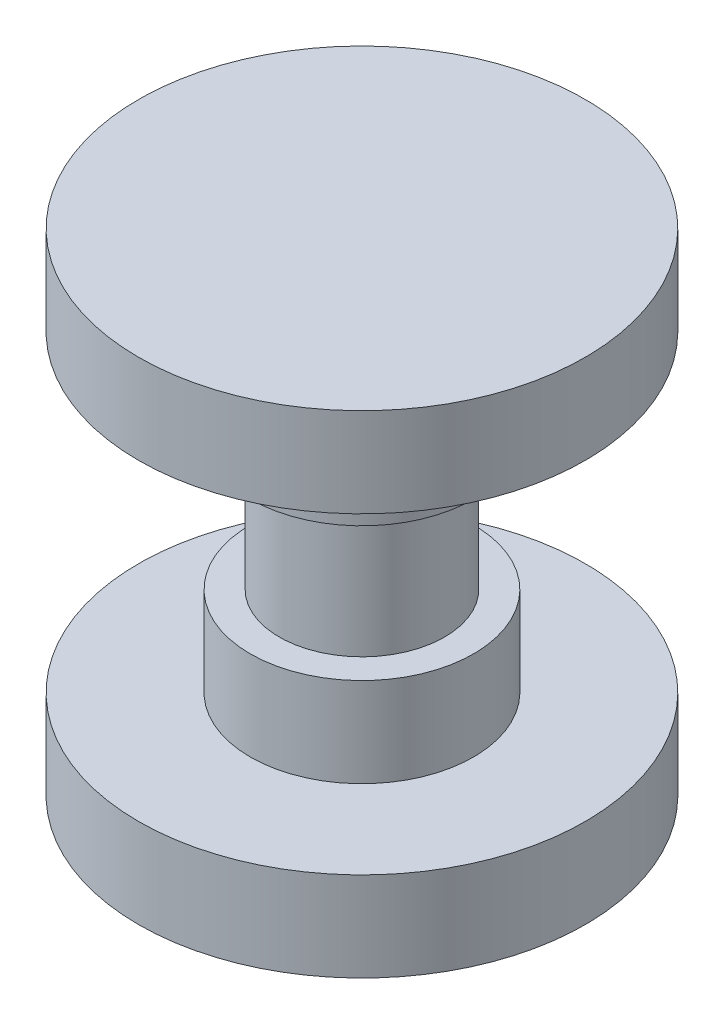
ISO-10303-21;
HEADER;
FILE_DESCRIPTION(('STEP AP214'),'2;1');
FILE_NAME('part.step','',(''),(''),'','','');
FILE_SCHEMA(('AUTOMOTIVE_DESIGN { 1 0 10303 214 1 1 1 1 }'));
ENDSEC;
DATA;
#1=APPLICATION_CONTEXT('core data for automotive mechanical design processes');
#2=APPLICATION_PROTOCOL_DEFINITION('international standard','automotive_design',2000,#1);
#3=PRODUCT_CONTEXT('',#1,'mechanical');
#4=PRODUCT('Part','Part','',(#3));
#5=PRODUCT_RELATED_PRODUCT_CATEGORY('part','',(#4));
#6=PRODUCT_DEFINITION_FORMATION('','',#4);
#7=PRODUCT_DEFINITION_CONTEXT('part definition',#1,'design');
#8=PRODUCT_DEFINITION('design','',#6,#7);
#9=PRODUCT_DEFINITION_SHAPE('','',#8);
#10=(LENGTH_UNIT() NAMED_UNIT(*) SI_UNIT(.MILLI.,.METRE.));
#11=(NAMED_UNIT(*) PLANE_ANGLE_UNIT() SI_UNIT($,.RADIAN.));
#12=(NAMED_UNIT(*) SI_UNIT($,.STERADIAN.) SOLID_ANGLE_UNIT());
#13=UNCERTAINTY_MEASURE_WITH_UNIT(LENGTH_MEASURE(1.E-05),#10,'distance_accuracy_value','');
#14=(GEOMETRIC_REPRESENTATION_CONTEXT(3) GLOBAL_UNCERTAINTY_ASSIGNED_CONTEXT((#13)) GLOBAL_UNIT_ASSIGNED_CONTEXT((#10,
#11,#12)) REPRESENTATION_CONTEXT('',''));
#15=CARTESIAN_POINT('',(0.,0.,0.));
#16=DIRECTION('',(0.,0.,1.));
#17=DIRECTION('',(1.,0.,0.));
#18=AXIS2_PLACEMENT_3D('',#15,#16,#17);
#19=CARTESIAN_POINT('',(0.,12.7,0.));
#20=DIRECTION('',(0.,-1.,0.));
#21=DIRECTION('',(0.,0.,-1.));
#22=AXIS2_PLACEMENT_3D('',#19,#20,#21);
#23=CYLINDRICAL_SURFACE('',#22,31.75);
#24=CARTESIAN_POINT('',(0.,12.7,0.));
#25=DIRECTION('',(0.,1.,0.));
#26=DIRECTION('',(0.,0.,1.));
#27=AXIS2_PLACEMENT_3D('',#24,#25,#26);
#28=CIRCLE('',#27,31.75);
#29=CARTESIAN_POINT('',(0.,12.7,31.75));
#30=VERTEX_POINT('',#29);
#31=EDGE_CURVE('E52',#30,#30,#28,.T.);
#32=ORIENTED_EDGE('',*,*,#31,.F.);
#33=EDGE_LOOP('',(#32));
#34=FACE_BOUND('',#33,.T.);
#35=CARTESIAN_POINT('',(0.,0.,0.));
#36=DIRECTION('',(0.,1.,0.));
#37=DIRECTION('',(0.,0.,1.));
#38=AXIS2_PLACEMENT_3D('',#35,#36,#37);
#39=CIRCLE('',#38,31.75);
#40=CARTESIAN_POINT('',(0.,0.,31.75));
#41=VERTEX_POINT('',#40);
#42=EDGE_CURVE('E43',#41,#41,#39,.T.);
#43=ORIENTED_EDGE('',*,*,#42,.T.);
#44=EDGE_LOOP('',(#43));
#45=FACE_BOUND('',#44,.T.);
#46=ADVANCED_FACE('F40',(#34,#45),#23,.T.);
#47=CARTESIAN_POINT('',(0.,12.7,0.));
#48=DIRECTION('',(0.,1.,0.));
#49=DIRECTION('',(0.,0.,1.));
#50=AXIS2_PLACEMENT_3D('',#47,#48,#49);
#51=PLANE('',#50);
#52=CARTESIAN_POINT('',(0.,12.7,0.));
#53=DIRECTION('',(0.,1.,0.));
#54=DIRECTION('',(0.,0.,1.));
#55=AXIS2_PLACEMENT_3D('',#52,#53,#54);
#56=CIRCLE('',#55,15.875);
#57=CARTESIAN_POINT('',(0.,12.7,15.875));
#58=VERTEX_POINT('',#57);
#59=EDGE_CURVE('E47',#58,#58,#56,.T.);
#60=ORIENTED_EDGE('',*,*,#59,.F.);
#61=EDGE_LOOP('',(#60));
#62=FACE_BOUND('',#61,.T.);
#63=ORIENTED_EDGE('',*,*,#31,.T.);
#64=EDGE_LOOP('',(#63));
#65=FACE_BOUND('',#64,.T.);
#66=ADVANCED_FACE('F70',(#62,#65),#51,.T.);
#67=CARTESIAN_POINT('',(0.,0.,0.));
#68=DIRECTION('',(0.,1.,0.));
#69=DIRECTION('',(0.,0.,1.));
#70=AXIS2_PLACEMENT_3D('',#67,#68,#69);
#71=PLANE('',#70);
#72=ORIENTED_EDGE('',*,*,#42,.F.);
#73=EDGE_LOOP('',(#72));
#74=FACE_BOUND('',#73,.T.);
#75=ADVANCED_FACE('F67',(#74),#71,.F.);
#76=CARTESIAN_POINT('',(0.,25.4,0.));
#77=DIRECTION('',(0.,-1.,0.));
#78=DIRECTION('',(0.,0.,-1.));
#79=AXIS2_PLACEMENT_3D('',#76,#77,#78);
#80=CYLINDRICAL_SURFACE('',#79,15.875);
#81=CARTESIAN_POINT('',(0.,25.4,0.));
#82=DIRECTION('',(0.,1.,0.));
#83=DIRECTION('',(0.,0.,1.));
#84=AXIS2_PLACEMENT_3D('',#81,#82,#83);
#85=CIRCLE('',#84,15.875);
#86=CARTESIAN_POINT('',(0.,25.4,15.875));
#87=VERTEX_POINT('',#86);
#88=EDGE_CURVE('E58',#87,#87,#85,.T.);
#89=ORIENTED_EDGE('',*,*,#88,.F.);
#90=EDGE_LOOP('',(#89));
#91=FACE_BOUND('',#90,.T.);
#92=ORIENTED_EDGE('',*,*,#59,.T.);
#93=EDGE_LOOP('',(#92));
#94=FACE_BOUND('',#93,.T.);
#95=ADVANCED_FACE('F69',(#91,#94),#80,.T.);
#96=CARTESIAN_POINT('',(0.,25.4,0.));
#97=DIRECTION('',(0.,1.,0.));
#98=DIRECTION('',(0.,0.,1.));
#99=AXIS2_PLACEMENT_3D('',#96,#97,#98);
#100=PLANE('',#99);
#101=CARTESIAN_POINT('',(0.,25.4,0.));
#102=DIRECTION('',(0.,1.,0.));
#103=DIRECTION('',(0.,0.,1.));
#104=AXIS2_PLACEMENT_3D('',#101,#102,#103);
#105=CIRCLE('',#104,11.7475);
#106=CARTESIAN_POINT('',(0.,25.4,-11.7475));
#107=VERTEX_POINT('',#106);
#108=EDGE_CURVE('E10',#107,#107,#105,.T.);
#109=ORIENTED_EDGE('',*,*,#108,.F.);
#110=EDGE_LOOP('',(#109));
#111=FACE_BOUND('',#110,.T.);
#112=ORIENTED_EDGE('',*,*,#88,.T.);
#113=EDGE_LOOP('',(#112));
#114=FACE_BOUND('',#113,.T.);
#115=ADVANCED_FACE('F75',(#111,#114),#100,.T.);
#116=CARTESIAN_POINT('',(0.,44.45,0.));
#117=DIRECTION('',(0.,-1.,0.));
#118=DIRECTION('',(0.,0.,-1.));
#119=AXIS2_PLACEMENT_3D('',#116,#117,#118);
#120=CYLINDRICAL_SURFACE('',#119,11.7475);
#121=CARTESIAN_POINT('',(0.,44.45,0.));
#122=DIRECTION('',(0.,1.,0.));
#123=DIRECTION('',(0.,0.,1.));
#124=AXIS2_PLACEMENT_3D('',#121,#122,#123);
#125=CIRCLE('',#124,11.7475);
#126=CARTESIAN_POINT('',(0.,44.45,-11.7475));
#127=VERTEX_POINT('',#126);
#128=EDGE_CURVE('E56',#127,#127,#125,.T.);
#129=CARTESIAN_POINT('',(0.,44.45,-11.7475));
#130=CARTESIAN_POINT('',(0.,44.2515625,-11.7475));
#131=CARTESIAN_POINT('',(0.,44.053125,-11.7475));
#132=CARTESIAN_POINT('',(0.,43.65625,-11.7475));
#133=CARTESIAN_POINT('',(0.,43.4578125,-11.7475));
#134=CARTESIAN_POINT('',(0.,43.0609375,-11.7475));
#135=CARTESIAN_POINT('',(0.,42.8625,-11.7475));
#136=CARTESIAN_POINT('',(0.,42.465625,-11.7475));
#137=CARTESIAN_POINT('',(0.,42.2671875,-11.7475));
#138=CARTESIAN_POINT('',(0.,41.8703125,-11.7475));
#139=CARTESIAN_POINT('',(0.,41.671875,-11.7475));
#140=CARTESIAN_POINT('',(0.,41.275,-11.7475));
#141=CARTESIAN_POINT('',(0.,41.0765625,-11.7475));
#142=CARTESIAN_POINT('',(0.,40.6796875,-11.7475));
#143=CARTESIAN_POINT('',(0.,40.48125,-11.7475));
#144=CARTESIAN_POINT('',(0.,40.084375,-11.7475));
#145=CARTESIAN_POINT('',(0.,39.8859375,-11.7475));
#146=CARTESIAN_POINT('',(0.,39.4890625,-11.7475));
#147=CARTESIAN_POINT('',(0.,39.290625,-11.7475));
#148=CARTESIAN_POINT('',(0.,38.89375,-11.7475));
#149=CARTESIAN_POINT('',(0.,38.6953125,-11.7475));
#150=CARTESIAN_POINT('',(0.,38.2984375,-11.7475));
#151=CARTESIAN_POINT('',(0.,38.1,-11.7475));
#152=CARTESIAN_POINT('',(0.,37.703125,-11.7475));
#153=CARTESIAN_POINT('',(0.,37.5046875,-11.7475));
#154=CARTESIAN_POINT('',(0.,37.1078125,-11.7475));
#155=CARTESIAN_POINT('',(0.,36.909375,-11.7475));
#156=CARTESIAN_POINT('',(0.,36.5125,-11.7475));
#157=CARTESIAN_POINT('',(0.,36.3140625,-11.7475));
#158=CARTESIAN_POINT('',(0.,35.9171875,-11.7475));
#159=CARTESIAN_POINT('',(0.,35.71875,-11.7475));
#160=CARTESIAN_POINT('',(0.,35.321875,-11.7475));
#161=CARTESIAN_POINT('',(0.,35.1234375,-11.7475));
#162=CARTESIAN_POINT('',(0.,34.7265625,-11.7475));
#163=CARTESIAN_POINT('',(0.,34.528125,-11.7475));
#164=CARTESIAN_POINT('',(0.,34.13125,-11.7475));
#165=CARTESIAN_POINT('',(0.,33.9328125,-11.7475));
#166=CARTESIAN_POINT('',(0.,33.5359375,-11.7475));
#167=CARTESIAN_POINT('',(0.,33.3375,-11.7475));
#168=CARTESIAN_POINT('',(0.,32.940625,-11.7475));
#169=CARTESIAN_POINT('',(0.,32.7421875,-11.7475));
#170=CARTESIAN_POINT('',(0.,32.3453125,-11.7475));
#171=CARTESIAN_POINT('',(0.,32.146875,-11.7475));
#172=CARTESIAN_POINT('',(0.,31.75,-11.7475));
#173=CARTESIAN_POINT('',(0.,31.5515625,-11.7475));
#174=CARTESIAN_POINT('',(0.,31.1546875,-11.7475));
#175=CARTESIAN_POINT('',(0.,30.95625,-11.7475));
#176=CARTESIAN_POINT('',(0.,30.559375,-11.7475));
#177=CARTESIAN_POINT('',(0.,30.3609375,-11.7475));
#178=CARTESIAN_POINT('',(0.,29.9640625,-11.7475));
#179=CARTESIAN_POINT('',(0.,29.765625,-11.7475));
#180=CARTESIAN_POINT('',(0.,29.36875,-11.7475));
#181=CARTESIAN_POINT('',(0.,29.1703125,-11.7475));
#182=CARTESIAN_POINT('',(0.,28.7734375,-11.7475));
#183=CARTESIAN_POINT('',(0.,28.575,-11.7475));
#184=CARTESIAN_POINT('',(0.,28.178125,-11.7475));
#185=CARTESIAN_POINT('',(0.,27.9796875,-11.7475));
#186=CARTESIAN_POINT('',(0.,27.5828125,-11.7475));
#187=CARTESIAN_POINT('',(0.,27.384375,-11.7475));
#188=CARTESIAN_POINT('',(0.,26.9875,-11.7475));
#189=CARTESIAN_POINT('',(0.,26.7890625,-11.7475));
#190=CARTESIAN_POINT('',(0.,26.3921875,-11.7475));
#191=CARTESIAN_POINT('',(0.,26.19375,-11.7475));
#192=CARTESIAN_POINT('',(0.,25.796875,-11.7475));
#193=CARTESIAN_POINT('',(0.,25.5984375,-11.7475));
#194=CARTESIAN_POINT('',(0.,25.4,-11.7475));
#195=B_SPLINE_CURVE_WITH_KNOTS('',3,(#129,#130,#131,#132,#133,#134,#135,#136,#137,#138,#139,
#140,#141,#142,#143,#144,#145,#146,#147,#148,#149,#150,#151,#152,#153,#154,#155,#156,#157,#158,
#159,#160,#161,#162,#163,#164,#165,#166,#167,#168,#169,#170,#171,#172,#173,#174,#175,#176,#177,
#178,#179,#180,#181,#182,#183,#184,#185,#186,#187,#188,#189,#190,#191,#192,#193,#194),
.UNSPECIFIED.,.F.,.F.,(4,2,2,2,2,2,2,2,2,2,2,2,2,2,2,2,2,2,2,2,2,2,2,2,2,2,2,2,2,2,2,2,4),(0.,
0.5953125,1.190625,1.7859375,2.38125,2.9765625,3.571875,4.1671875,4.7625,5.3578125,5.953125,
6.5484375,7.14375,7.7390625,8.334375,8.92968750000001,9.52500000000001,10.1203125,10.715625,
11.3109375,11.90625,12.5015625,13.096875,13.6921875,14.2875,14.8828125,15.478125,16.0734375,
16.66875,17.2640625,17.859375,18.4546875,19.05),.UNSPECIFIED.);
#196=EDGE_CURVE('BSEAM107',#127,#107,#195,.T.);
#197=ORIENTED_EDGE('',*,*,#128,.F.);
#198=ORIENTED_EDGE('',*,*,#108,.T.);
#199=ORIENTED_EDGE('',*,*,#196,.T.);
#200=ORIENTED_EDGE('',*,*,#196,.F.);
#201=EDGE_LOOP('',(#197,#199,#198,#200));
#202=FACE_BOUND('',#201,.T.);
#203=ADVANCED_FACE('F107',(#202),#120,.T.);
#204=CARTESIAN_POINT('',(0.,57.15,0.));
#205=DIRECTION('',(0.,-1.,0.));
#206=DIRECTION('',(0.,0.,-1.));
#207=AXIS2_PLACEMENT_3D('',#204,#205,#206);
#208=CYLINDRICAL_SURFACE('',#207,15.875);
#209=CARTESIAN_POINT('',(0.,57.15,0.));
#210=DIRECTION('',(0.,1.,0.));
#211=DIRECTION('',(0.,0.,1.));
#212=AXIS2_PLACEMENT_3D('',#209,#210,#211);
#213=CIRCLE('',#212,15.875);
#214=CARTESIAN_POINT('',(0.,57.15,15.875));
#215=VERTEX_POINT('',#214);
#216=EDGE_CURVE('E198',#215,#215,#213,.T.);
#217=ORIENTED_EDGE('',*,*,#216,.F.);
#218=EDGE_LOOP('',(#217));
#219=FACE_BOUND('',#218,.T.);
#220=CARTESIAN_POINT('',(0.,44.45,0.));
#221=DIRECTION('',(0.,1.,0.));
#222=DIRECTION('',(0.,0.,1.));
#223=AXIS2_PLACEMENT_3D('',#220,#221,#222);
#224=CIRCLE('',#223,15.875);
#225=CARTESIAN_POINT('',(0.,44.45,15.875));
#226=VERTEX_POINT('',#225);
#227=EDGE_CURVE('E206',#226,#226,#224,.T.);
#228=ORIENTED_EDGE('',*,*,#227,.T.);
#229=EDGE_LOOP('',(#228));
#230=FACE_BOUND('',#229,.T.);
#231=ADVANCED_FACE('F118',(#219,#230),#208,.T.);
#232=CARTESIAN_POINT('',(0.,44.45,0.));
#233=DIRECTION('',(0.,1.,0.));
#234=DIRECTION('',(0.,0.,1.));
#235=AXIS2_PLACEMENT_3D('',#232,#233,#234);
#236=PLANE('',#235);
#237=ORIENTED_EDGE('',*,*,#128,.T.);
#238=EDGE_LOOP('',(#237));
#239=FACE_BOUND('',#238,.T.);
#240=ORIENTED_EDGE('',*,*,#227,.F.);
#241=EDGE_LOOP('',(#240));
#242=FACE_BOUND('',#241,.T.);
#243=ADVANCED_FACE('F129',(#239,#242),#236,.F.);
#244=CARTESIAN_POINT('',(0.,69.85,0.));
#245=DIRECTION('',(0.,-1.,0.));
#246=DIRECTION('',(0.,0.,-1.));
#247=AXIS2_PLACEMENT_3D('',#244,#245,#246);
#248=CYLINDRICAL_SURFACE('',#247,31.75);
#249=CARTESIAN_POINT('',(0.,69.85,0.));
#250=DIRECTION('',(0.,1.,0.));
#251=DIRECTION('',(0.,0.,1.));
#252=AXIS2_PLACEMENT_3D('',#249,#250,#251);
#253=CIRCLE('',#252,31.75);
#254=CARTESIAN_POINT('',(0.,69.85,31.75));
#255=VERTEX_POINT('',#254);
#256=EDGE_CURVE('E203',#255,#255,#253,.T.);
#257=ORIENTED_EDGE('',*,*,#256,.F.);
#258=EDGE_LOOP('',(#257));
#259=FACE_BOUND('',#258,.T.);
#260=CARTESIAN_POINT('',(0.,57.15,0.));
#261=DIRECTION('',(0.,1.,0.));
#262=DIRECTION('',(0.,0.,1.));
#263=AXIS2_PLACEMENT_3D('',#260,#261,#262);
#264=CIRCLE('',#263,31.75);
#265=CARTESIAN_POINT('',(0.,57.15,31.75));
#266=VERTEX_POINT('',#265);
#267=EDGE_CURVE('E201',#266,#266,#264,.T.);
#268=ORIENTED_EDGE('',*,*,#267,.T.);
#269=EDGE_LOOP('',(#268));
#270=FACE_BOUND('',#269,.T.);
#271=ADVANCED_FACE('F140',(#259,#270),#248,.T.);
#272=CARTESIAN_POINT('',(0.,69.85,0.));
#273=DIRECTION('',(0.,1.,0.));
#274=DIRECTION('',(0.,0.,1.));
#275=AXIS2_PLACEMENT_3D('',#272,#273,#274);
#276=PLANE('',#275);
#277=ORIENTED_EDGE('',*,*,#256,.T.);
#278=EDGE_LOOP('',(#277));
#279=FACE_BOUND('',#278,.T.);
#280=ADVANCED_FACE('F151',(#279),#276,.T.);
#281=CARTESIAN_POINT('',(0.,57.15,0.));
#282=DIRECTION('',(0.,1.,0.));
#283=DIRECTION('',(0.,0.,1.));
#284=AXIS2_PLACEMENT_3D('',#281,#282,#283);
#285=PLANE('',#284);
#286=ORIENTED_EDGE('',*,*,#216,.T.);
#287=EDGE_LOOP('',(#286));
#288=FACE_BOUND('',#287,.T.);
#289=ORIENTED_EDGE('',*,*,#267,.F.);
#290=EDGE_LOOP('',(#289));
#291=FACE_BOUND('',#290,.T.);
#292=ADVANCED_FACE('F162',(#288,#291),#285,.F.);
#293=CLOSED_SHELL('',(#46,#66,#75,#95,#115,#203,#231,#243,#271,#280,#292));
#294=MANIFOLD_SOLID_BREP('B2',#293);
#295=ADVANCED_BREP_SHAPE_REPRESENTATION('',(#18,#294),#14);
#296=SHAPE_DEFINITION_REPRESENTATION(#9,#295);
ENDSEC;
END-ISO-10303-21;
